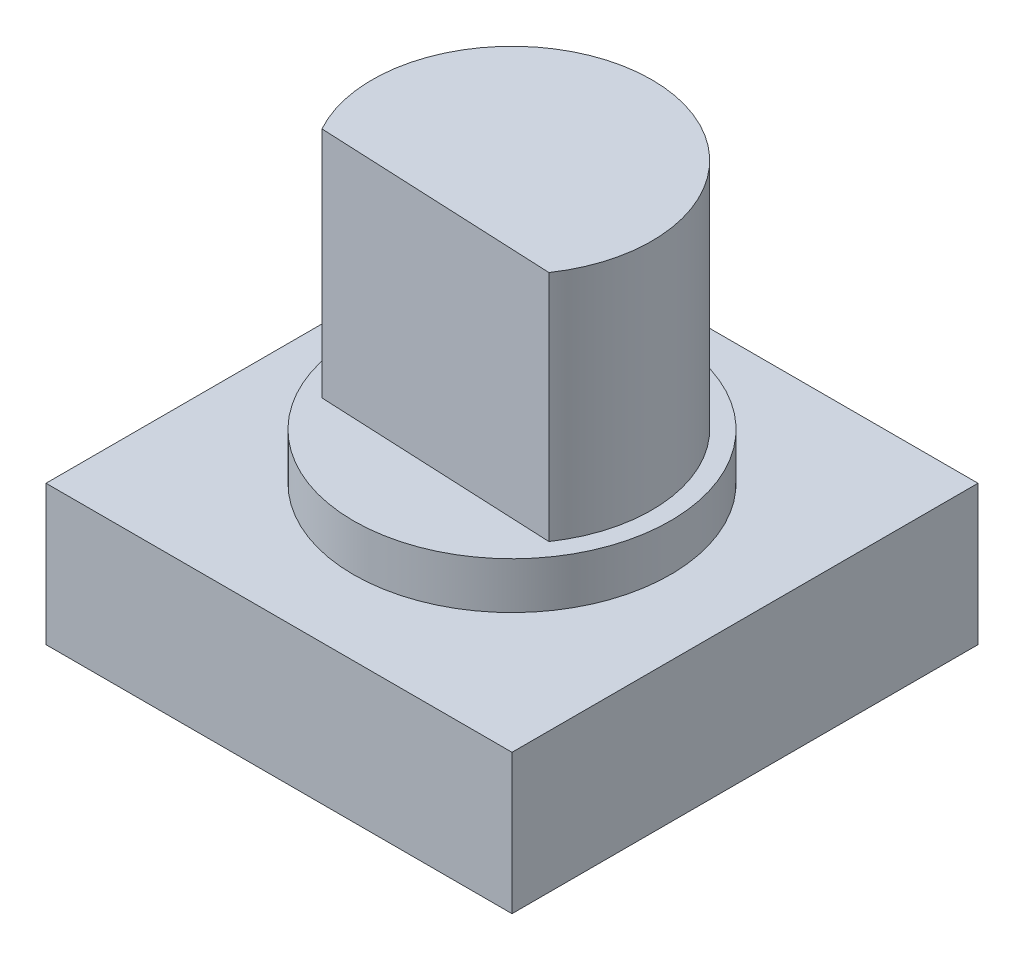
ISO-10303-21;
HEADER;
FILE_DESCRIPTION(('STEP AP214'),'2;1');
FILE_NAME('part.step','',(''),(''),'','','');
FILE_SCHEMA(('AUTOMOTIVE_DESIGN { 1 0 10303 214 1 1 1 1 }'));
ENDSEC;
DATA;
#1=APPLICATION_CONTEXT('core data for automotive mechanical design processes');
#2=APPLICATION_PROTOCOL_DEFINITION('international standard','automotive_design',2000,#1);
#3=PRODUCT_CONTEXT('',#1,'mechanical');
#4=PRODUCT('Part','Part','',(#3));
#5=PRODUCT_RELATED_PRODUCT_CATEGORY('part','',(#4));
#6=PRODUCT_DEFINITION_FORMATION('','',#4);
#7=PRODUCT_DEFINITION_CONTEXT('part definition',#1,'design');
#8=PRODUCT_DEFINITION('design','',#6,#7);
#9=PRODUCT_DEFINITION_SHAPE('','',#8);
#10=(LENGTH_UNIT() NAMED_UNIT(*) SI_UNIT(.MILLI.,.METRE.));
#11=(NAMED_UNIT(*) PLANE_ANGLE_UNIT() SI_UNIT($,.RADIAN.));
#12=(NAMED_UNIT(*) SI_UNIT($,.STERADIAN.) SOLID_ANGLE_UNIT());
#13=UNCERTAINTY_MEASURE_WITH_UNIT(LENGTH_MEASURE(1.E-05),#10,'distance_accuracy_value','');
#14=(GEOMETRIC_REPRESENTATION_CONTEXT(3) GLOBAL_UNCERTAINTY_ASSIGNED_CONTEXT((#13)) GLOBAL_UNIT_ASSIGNED_CONTEXT((#10,
#11,#12)) REPRESENTATION_CONTEXT('',''));
#15=CARTESIAN_POINT('',(0.,0.,0.));
#16=DIRECTION('',(0.,0.,1.));
#17=DIRECTION('',(1.,0.,0.));
#18=AXIS2_PLACEMENT_3D('',#15,#16,#17);
#19=CARTESIAN_POINT('',(-5.37313432835821,3.,-2.64925373134329));
#20=DIRECTION('',(1.,0.,0.));
#21=DIRECTION('',(0.,0.,-1.));
#22=AXIS2_PLACEMENT_3D('',#19,#20,#21);
#23=PLANE('',#22);
#24=DIRECTION('',(0.,0.,1.));
#25=VECTOR('',#24,1.);
#26=CARTESIAN_POINT('',(-5.37313432835821,0.,-2.64925373134329));
#27=LINE('',#26,#25);
#28=CARTESIAN_POINT('',(-5.37313432835821,0.,-2.64925373134329));
#29=VERTEX_POINT('',#28);
#30=CARTESIAN_POINT('',(-5.37313432835821,0.,7.35074626865671));
#31=VERTEX_POINT('',#30);
#32=EDGE_CURVE('E127',#29,#31,#27,.T.);
#33=ORIENTED_EDGE('',*,*,#32,.T.);
#34=DIRECTION('',(0.,-1.,0.));
#35=VECTOR('',#34,1.);
#36=CARTESIAN_POINT('',(-5.37313432835821,3.,7.35074626865671));
#37=LINE('',#36,#35);
#38=CARTESIAN_POINT('',(-5.37313432835821,3.,7.35074626865671));
#39=VERTEX_POINT('',#38);
#40=EDGE_CURVE('E42',#39,#31,#37,.T.);
#41=ORIENTED_EDGE('',*,*,#40,.F.);
#42=DIRECTION('',(0.,0.,1.));
#43=VECTOR('',#42,1.);
#44=CARTESIAN_POINT('',(-5.37313432835821,3.,-2.64925373134329));
#45=LINE('',#44,#43);
#46=CARTESIAN_POINT('',(-5.37313432835821,3.,-2.64925373134329));
#47=VERTEX_POINT('',#46);
#48=EDGE_CURVE('E132',#47,#39,#45,.T.);
#49=ORIENTED_EDGE('',*,*,#48,.F.);
#50=DIRECTION('',(0.,-1.,0.));
#51=VECTOR('',#50,1.);
#52=CARTESIAN_POINT('',(-5.37313432835821,3.,-2.64925373134329));
#53=LINE('',#52,#51);
#54=EDGE_CURVE('E142',#47,#29,#53,.T.);
#55=ORIENTED_EDGE('',*,*,#54,.T.);
#56=EDGE_LOOP('',(#33,#41,#49,#55));
#57=FACE_BOUND('',#56,.T.);
#58=ADVANCED_FACE('F39',(#57),#23,.F.);
#59=CARTESIAN_POINT('',(-5.37313432835821,3.,7.35074626865671));
#60=DIRECTION('',(0.,0.,-1.));
#61=DIRECTION('',(-1.,0.,0.));
#62=AXIS2_PLACEMENT_3D('',#59,#60,#61);
#63=PLANE('',#62);
#64=DIRECTION('',(1.,0.,0.));
#65=VECTOR('',#64,1.);
#66=CARTESIAN_POINT('',(-5.37313432835821,0.,7.35074626865671));
#67=LINE('',#66,#65);
#68=CARTESIAN_POINT('',(4.62686567164179,0.,7.35074626865671));
#69=VERTEX_POINT('',#68);
#70=EDGE_CURVE('E146',#31,#69,#67,.T.);
#71=ORIENTED_EDGE('',*,*,#70,.T.);
#72=DIRECTION('',(0.,-1.,0.));
#73=VECTOR('',#72,1.);
#74=CARTESIAN_POINT('',(4.62686567164179,3.,7.35074626865671));
#75=LINE('',#74,#73);
#76=CARTESIAN_POINT('',(4.62686567164179,3.,7.35074626865671));
#77=VERTEX_POINT('',#76);
#78=EDGE_CURVE('E158',#77,#69,#75,.T.);
#79=ORIENTED_EDGE('',*,*,#78,.F.);
#80=DIRECTION('',(1.,0.,0.));
#81=VECTOR('',#80,1.);
#82=CARTESIAN_POINT('',(-5.37313432835821,3.,7.35074626865671));
#83=LINE('',#82,#81);
#84=EDGE_CURVE('E92',#39,#77,#83,.T.);
#85=ORIENTED_EDGE('',*,*,#84,.F.);
#86=ORIENTED_EDGE('',*,*,#40,.T.);
#87=EDGE_LOOP('',(#71,#79,#85,#86));
#88=FACE_BOUND('',#87,.T.);
#89=ADVANCED_FACE('F166',(#88),#63,.F.);
#90=CARTESIAN_POINT('',(4.62686567164179,3.,-2.64925373134329));
#91=DIRECTION('',(-1.,0.,0.));
#92=DIRECTION('',(0.,0.,1.));
#93=AXIS2_PLACEMENT_3D('',#90,#91,#92);
#94=PLANE('',#93);
#95=DIRECTION('',(0.,0.,-1.));
#96=VECTOR('',#95,1.);
#97=CARTESIAN_POINT('',(4.62686567164179,0.,-2.64925373134329));
#98=LINE('',#97,#96);
#99=CARTESIAN_POINT('',(4.62686567164179,0.,-2.64925373134329));
#100=VERTEX_POINT('',#99);
#101=EDGE_CURVE('E149',#69,#100,#98,.T.);
#102=ORIENTED_EDGE('',*,*,#101,.T.);
#103=DIRECTION('',(0.,-1.,0.));
#104=VECTOR('',#103,1.);
#105=CARTESIAN_POINT('',(4.62686567164179,3.,-2.64925373134329));
#106=LINE('',#105,#104);
#107=CARTESIAN_POINT('',(4.62686567164179,3.,-2.64925373134329));
#108=VERTEX_POINT('',#107);
#109=EDGE_CURVE('E156',#108,#100,#106,.T.);
#110=ORIENTED_EDGE('',*,*,#109,.F.);
#111=DIRECTION('',(0.,0.,-1.));
#112=VECTOR('',#111,1.);
#113=CARTESIAN_POINT('',(4.62686567164179,3.,-2.64925373134329));
#114=LINE('',#113,#112);
#115=EDGE_CURVE('E137',#77,#108,#114,.T.);
#116=ORIENTED_EDGE('',*,*,#115,.F.);
#117=ORIENTED_EDGE('',*,*,#78,.T.);
#118=EDGE_LOOP('',(#102,#110,#116,#117));
#119=FACE_BOUND('',#118,.T.);
#120=ADVANCED_FACE('F173',(#119),#94,.F.);
#121=CARTESIAN_POINT('',(-5.37313432835821,3.,-2.64925373134329));
#122=DIRECTION('',(0.,0.,1.));
#123=DIRECTION('',(1.,0.,0.));
#124=AXIS2_PLACEMENT_3D('',#121,#122,#123);
#125=PLANE('',#124);
#126=DIRECTION('',(-1.,0.,0.));
#127=VECTOR('',#126,1.);
#128=CARTESIAN_POINT('',(-5.37313432835821,0.,-2.64925373134329));
#129=LINE('',#128,#127);
#130=EDGE_CURVE('E84',#100,#29,#129,.T.);
#131=ORIENTED_EDGE('',*,*,#130,.T.);
#132=ORIENTED_EDGE('',*,*,#54,.F.);
#133=DIRECTION('',(-1.,0.,0.));
#134=VECTOR('',#133,1.);
#135=CARTESIAN_POINT('',(-5.37313432835821,3.,-2.64925373134329));
#136=LINE('',#135,#134);
#137=EDGE_CURVE('E63',#108,#47,#136,.T.);
#138=ORIENTED_EDGE('',*,*,#137,.F.);
#139=ORIENTED_EDGE('',*,*,#109,.T.);
#140=EDGE_LOOP('',(#131,#132,#138,#139));
#141=FACE_BOUND('',#140,.T.);
#142=ADVANCED_FACE('F174',(#141),#125,.F.);
#143=CARTESIAN_POINT('',(0.,3.,0.));
#144=DIRECTION('',(0.,1.,0.));
#145=DIRECTION('',(0.,0.,1.));
#146=AXIS2_PLACEMENT_3D('',#143,#144,#145);
#147=PLANE('',#146);
#148=CARTESIAN_POINT('',(-0.373134328358214,3.,2.35074626865671));
#149=DIRECTION('',(0.,1.,0.));
#150=DIRECTION('',(0.,0.,1.));
#151=AXIS2_PLACEMENT_3D('',#148,#149,#150);
#152=CIRCLE('',#151,3.4);
#153=CARTESIAN_POINT('',(-0.373134328358214,3.,5.75074626865671));
#154=VERTEX_POINT('',#153);
#155=EDGE_CURVE('E11',#154,#154,#152,.T.);
#156=ORIENTED_EDGE('',*,*,#155,.F.);
#157=EDGE_LOOP('',(#156));
#158=FACE_BOUND('',#157,.T.);
#159=ORIENTED_EDGE('',*,*,#48,.T.);
#160=ORIENTED_EDGE('',*,*,#84,.T.);
#161=ORIENTED_EDGE('',*,*,#115,.T.);
#162=ORIENTED_EDGE('',*,*,#137,.T.);
#163=EDGE_LOOP('',(#159,#160,#161,#162));
#164=FACE_BOUND('',#163,.T.);
#165=ADVANCED_FACE('F175',(#158,#164),#147,.T.);
#166=CARTESIAN_POINT('',(0.,0.,0.));
#167=DIRECTION('',(0.,1.,0.));
#168=DIRECTION('',(0.,0.,1.));
#169=AXIS2_PLACEMENT_3D('',#166,#167,#168);
#170=PLANE('',#169);
#171=ORIENTED_EDGE('',*,*,#32,.F.);
#172=ORIENTED_EDGE('',*,*,#130,.F.);
#173=ORIENTED_EDGE('',*,*,#101,.F.);
#174=ORIENTED_EDGE('',*,*,#70,.F.);
#175=EDGE_LOOP('',(#171,#172,#173,#174));
#176=FACE_BOUND('',#175,.T.);
#177=ADVANCED_FACE('F171',(#176),#170,.F.);
#178=CARTESIAN_POINT('',(-0.373134328358214,4.,2.35074626865671));
#179=DIRECTION('',(0.,-1.,0.));
#180=DIRECTION('',(0.,0.,-1.));
#181=AXIS2_PLACEMENT_3D('',#178,#179,#180);
#182=CYLINDRICAL_SURFACE('',#181,3.4);
#183=CARTESIAN_POINT('',(-0.373134328358214,4.,2.35074626865671));
#184=DIRECTION('',(0.,1.,0.));
#185=DIRECTION('',(0.,0.,1.));
#186=AXIS2_PLACEMENT_3D('',#183,#184,#185);
#187=CIRCLE('',#186,3.4);
#188=CARTESIAN_POINT('',(-0.373134328358214,4.,5.75074626865671));
#189=VERTEX_POINT('',#188);
#190=EDGE_CURVE('E122',#189,#189,#187,.T.);
#191=ORIENTED_EDGE('',*,*,#190,.F.);
#192=EDGE_LOOP('',(#191));
#193=FACE_BOUND('',#192,.T.);
#194=ORIENTED_EDGE('',*,*,#155,.T.);
#195=EDGE_LOOP('',(#194));
#196=FACE_BOUND('',#195,.T.);
#197=ADVANCED_FACE('F183',(#193,#196),#182,.T.);
#198=CARTESIAN_POINT('',(-0.373134328358214,4.,2.35074626865671));
#199=DIRECTION('',(0.,1.,0.));
#200=DIRECTION('',(0.,0.,1.));
#201=AXIS2_PLACEMENT_3D('',#198,#199,#200);
#202=PLANE('',#201);
#203=CARTESIAN_POINT('',(-0.373134328358214,4.,2.35074626865671));
#204=DIRECTION('',(0.,1.,0.));
#205=DIRECTION('',(0.,0.,1.));
#206=AXIS2_PLACEMENT_3D('',#203,#204,#205);
#207=CIRCLE('',#206,3.);
#208=CARTESIAN_POINT('',(2.10690235470572,4.,4.03876820295059));
#209=VERTEX_POINT('',#208);
#210=CARTESIAN_POINT('',(-2.99741190135198,4.,3.80441996652771));
#211=VERTEX_POINT('',#210);
#212=EDGE_CURVE('E120',#209,#211,#207,.T.);
#213=ORIENTED_EDGE('',*,*,#212,.F.);
#214=DIRECTION('',(0.998947716763297,0.,0.0458634840956969));
#215=VECTOR('',#214,1.);
#216=CARTESIAN_POINT('',(-2.99741190135198,4.,3.80441996652771));
#217=LINE('',#216,#215);
#218=EDGE_CURVE('E54',#211,#209,#217,.T.);
#219=ORIENTED_EDGE('',*,*,#218,.F.);
#220=EDGE_LOOP('',(#213,#219));
#221=FACE_BOUND('',#220,.T.);
#222=ORIENTED_EDGE('',*,*,#190,.T.);
#223=EDGE_LOOP('',(#222));
#224=FACE_BOUND('',#223,.T.);
#225=ADVANCED_FACE('F221',(#221,#224),#202,.T.);
#226=CARTESIAN_POINT('',(-0.373134328358214,9.,2.35074626865671));
#227=DIRECTION('',(0.,-1.,0.));
#228=DIRECTION('',(0.,0.,-1.));
#229=AXIS2_PLACEMENT_3D('',#226,#227,#228);
#230=CYLINDRICAL_SURFACE('',#229,3.);
#231=ORIENTED_EDGE('',*,*,#212,.T.);
#232=DIRECTION('',(0.,-1.,0.));
#233=VECTOR('',#232,1.);
#234=CARTESIAN_POINT('',(-2.99741190135198,9.,3.80441996652771));
#235=LINE('',#234,#233);
#236=CARTESIAN_POINT('',(-2.99741190135198,9.,3.80441996652771));
#237=VERTEX_POINT('',#236);
#238=EDGE_CURVE('E106',#237,#211,#235,.T.);
#239=ORIENTED_EDGE('',*,*,#238,.F.);
#240=CARTESIAN_POINT('',(-0.373134328358214,9.,2.35074626865671));
#241=DIRECTION('',(0.,1.,0.));
#242=DIRECTION('',(0.,0.,1.));
#243=AXIS2_PLACEMENT_3D('',#240,#241,#242);
#244=CIRCLE('',#243,3.);
#245=CARTESIAN_POINT('',(2.10690235470572,9.,4.03876820295059));
#246=VERTEX_POINT('',#245);
#247=EDGE_CURVE('E113',#246,#237,#244,.T.);
#248=ORIENTED_EDGE('',*,*,#247,.F.);
#249=DIRECTION('',(0.,-1.,0.));
#250=VECTOR('',#249,1.);
#251=CARTESIAN_POINT('',(2.10690235470572,9.,4.03876820295059));
#252=LINE('',#251,#250);
#253=EDGE_CURVE('E109',#246,#209,#252,.T.);
#254=ORIENTED_EDGE('',*,*,#253,.T.);
#255=EDGE_LOOP('',(#231,#239,#248,#254));
#256=FACE_BOUND('',#255,.T.);
#257=ADVANCED_FACE('F119',(#256),#230,.T.);
#258=CARTESIAN_POINT('',(-2.99741190135198,9.,3.80441996652771));
#259=DIRECTION('',(0.0458634840956969,0.,-0.998947716763297));
#260=DIRECTION('',(-0.998947716763297,0.,-0.0458634840956969));
#261=AXIS2_PLACEMENT_3D('',#258,#259,#260);
#262=PLANE('',#261);
#263=ORIENTED_EDGE('',*,*,#218,.T.);
#264=ORIENTED_EDGE('',*,*,#253,.F.);
#265=DIRECTION('',(0.998947716763297,0.,0.0458634840956969));
#266=VECTOR('',#265,1.);
#267=CARTESIAN_POINT('',(-2.99741190135198,9.,3.80441996652771));
#268=LINE('',#267,#266);
#269=EDGE_CURVE('E102',#237,#246,#268,.T.);
#270=ORIENTED_EDGE('',*,*,#269,.F.);
#271=ORIENTED_EDGE('',*,*,#238,.T.);
#272=EDGE_LOOP('',(#263,#264,#270,#271));
#273=FACE_BOUND('',#272,.T.);
#274=ADVANCED_FACE('F104',(#273),#262,.F.);
#275=CARTESIAN_POINT('',(-0.373134328358214,9.,2.35074626865671));
#276=DIRECTION('',(0.,1.,0.));
#277=DIRECTION('',(0.,0.,1.));
#278=AXIS2_PLACEMENT_3D('',#275,#276,#277);
#279=PLANE('',#278);
#280=ORIENTED_EDGE('',*,*,#247,.T.);
#281=ORIENTED_EDGE('',*,*,#269,.T.);
#282=EDGE_LOOP('',(#280,#281));
#283=FACE_BOUND('',#282,.T.);
#284=ADVANCED_FACE('F115',(#283),#279,.T.);
#285=CLOSED_SHELL('',(#58,#89,#120,#142,#165,#177,#197,#225,#257,#274,#284));
#286=MANIFOLD_SOLID_BREP('B2',#285);
#287=ADVANCED_BREP_SHAPE_REPRESENTATION('',(#18,#286),#14);
#288=SHAPE_DEFINITION_REPRESENTATION(#9,#287);
ENDSEC;
END-ISO-10303-21;
